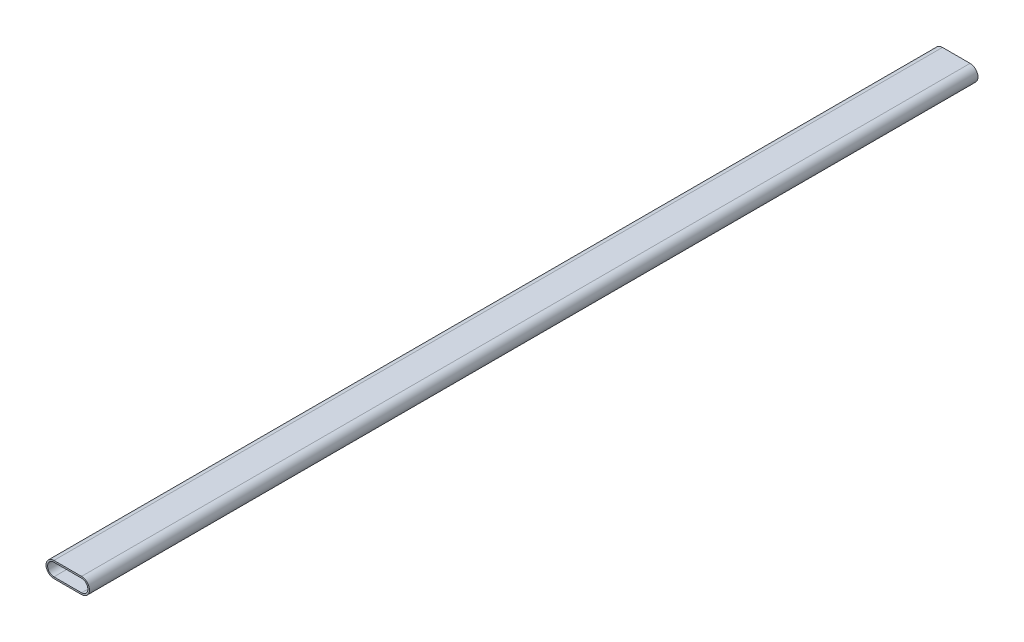
ISO-10303-21;
HEADER;
FILE_DESCRIPTION(('STEP AP214'),'2;1');
FILE_NAME('part.step','',(''),(''),'','','');
FILE_SCHEMA(('AUTOMOTIVE_DESIGN { 1 0 10303 214 1 1 1 1 }'));
ENDSEC;
DATA;
#1=APPLICATION_CONTEXT('core data for automotive mechanical design processes');
#2=APPLICATION_PROTOCOL_DEFINITION('international standard','automotive_design',2000,#1);
#3=PRODUCT_CONTEXT('',#1,'mechanical');
#4=PRODUCT('Part','Part','',(#3));
#5=PRODUCT_RELATED_PRODUCT_CATEGORY('part','',(#4));
#6=PRODUCT_DEFINITION_FORMATION('','',#4);
#7=PRODUCT_DEFINITION_CONTEXT('part definition',#1,'design');
#8=PRODUCT_DEFINITION('design','',#6,#7);
#9=PRODUCT_DEFINITION_SHAPE('','',#8);
#10=(LENGTH_UNIT() NAMED_UNIT(*) SI_UNIT(.MILLI.,.METRE.));
#11=(NAMED_UNIT(*) PLANE_ANGLE_UNIT() SI_UNIT($,.RADIAN.));
#12=(NAMED_UNIT(*) SI_UNIT($,.STERADIAN.) SOLID_ANGLE_UNIT());
#13=UNCERTAINTY_MEASURE_WITH_UNIT(LENGTH_MEASURE(1.E-05),#10,'distance_accuracy_value','');
#14=(GEOMETRIC_REPRESENTATION_CONTEXT(3) GLOBAL_UNCERTAINTY_ASSIGNED_CONTEXT((#13)) GLOBAL_UNIT_ASSIGNED_CONTEXT((#10,
#11,#12)) REPRESENTATION_CONTEXT('',''));
#15=CARTESIAN_POINT('',(0.,0.,0.));
#16=DIRECTION('',(0.,0.,1.));
#17=DIRECTION('',(1.,0.,0.));
#18=AXIS2_PLACEMENT_3D('',#15,#16,#17);
#19=CARTESIAN_POINT('',(0.,0.,675.));
#20=DIRECTION('',(0.,0.,1.));
#21=DIRECTION('',(1.,0.,0.));
#22=AXIS2_PLACEMENT_3D('',#19,#20,#21);
#23=PLANE('',#22);
#24=CARTESIAN_POINT('',(0.,0.,675.));
#25=DIRECTION('',(0.,0.,1.));
#26=DIRECTION('',(1.,0.,0.));
#27=AXIS2_PLACEMENT_3D('',#24,#25,#26);
#28=CIRCLE('',#27,6.);
#29=CARTESIAN_POINT('',(0.,6.,675.));
#30=VERTEX_POINT('',#29);
#31=CARTESIAN_POINT('',(0.,-6.,675.));
#32=VERTEX_POINT('',#31);
#33=EDGE_CURVE('E134',#30,#32,#28,.T.);
#34=ORIENTED_EDGE('',*,*,#33,.T.);
#35=DIRECTION('',(1.,0.,0.));
#36=VECTOR('',#35,1.);
#37=CARTESIAN_POINT('',(0.,-6.,675.));
#38=LINE('',#37,#36);
#39=CARTESIAN_POINT('',(21.,-6.,675.));
#40=VERTEX_POINT('',#39);
#41=EDGE_CURVE('E137',#32,#40,#38,.T.);
#42=ORIENTED_EDGE('',*,*,#41,.T.);
#43=CARTESIAN_POINT('',(21.,0.,675.));
#44=DIRECTION('',(0.,0.,1.));
#45=DIRECTION('',(1.,0.,0.));
#46=AXIS2_PLACEMENT_3D('',#43,#44,#45);
#47=CIRCLE('',#46,6.);
#48=CARTESIAN_POINT('',(21.,6.,675.));
#49=VERTEX_POINT('',#48);
#50=EDGE_CURVE('E140',#40,#49,#47,.T.);
#51=ORIENTED_EDGE('',*,*,#50,.T.);
#52=DIRECTION('',(-1.,0.,0.));
#53=VECTOR('',#52,1.);
#54=CARTESIAN_POINT('',(0.,6.,675.));
#55=LINE('',#54,#53);
#56=EDGE_CURVE('E142',#49,#30,#55,.T.);
#57=ORIENTED_EDGE('',*,*,#56,.T.);
#58=EDGE_LOOP('',(#34,#42,#51,#57));
#59=FACE_BOUND('',#58,.T.);
#60=DIRECTION('',(1.,0.,0.));
#61=VECTOR('',#60,1.);
#62=CARTESIAN_POINT('',(0.,-4.8,675.));
#63=LINE('',#62,#61);
#64=CARTESIAN_POINT('',(0.,-4.8,675.));
#65=VERTEX_POINT('',#64);
#66=CARTESIAN_POINT('',(21.,-4.8,675.));
#67=VERTEX_POINT('',#66);
#68=EDGE_CURVE('E106',#65,#67,#63,.T.);
#69=ORIENTED_EDGE('',*,*,#68,.F.);
#70=CARTESIAN_POINT('',(0.,0.,675.));
#71=DIRECTION('',(0.,0.,1.));
#72=DIRECTION('',(1.,0.,0.));
#73=AXIS2_PLACEMENT_3D('',#70,#71,#72);
#74=CIRCLE('',#73,4.8);
#75=CARTESIAN_POINT('',(0.,4.8,675.));
#76=VERTEX_POINT('',#75);
#77=EDGE_CURVE('E98',#76,#65,#74,.T.);
#78=ORIENTED_EDGE('',*,*,#77,.F.);
#79=DIRECTION('',(-1.,0.,0.));
#80=VECTOR('',#79,1.);
#81=CARTESIAN_POINT('',(0.,4.8,675.));
#82=LINE('',#81,#80);
#83=CARTESIAN_POINT('',(21.,4.8,675.));
#84=VERTEX_POINT('',#83);
#85=EDGE_CURVE('E120',#84,#76,#82,.T.);
#86=ORIENTED_EDGE('',*,*,#85,.F.);
#87=CARTESIAN_POINT('',(21.,0.,675.));
#88=DIRECTION('',(0.,0.,1.));
#89=DIRECTION('',(1.,0.,0.));
#90=AXIS2_PLACEMENT_3D('',#87,#88,#89);
#91=CIRCLE('',#90,4.8);
#92=EDGE_CURVE('E118',#67,#84,#91,.T.);
#93=ORIENTED_EDGE('',*,*,#92,.F.);
#94=EDGE_LOOP('',(#69,#78,#86,#93));
#95=FACE_BOUND('',#94,.T.);
#96=ADVANCED_FACE('F33',(#59,#95),#23,.T.);
#97=CARTESIAN_POINT('',(0.,0.,0.));
#98=DIRECTION('',(0.,0.,1.));
#99=DIRECTION('',(1.,0.,0.));
#100=AXIS2_PLACEMENT_3D('',#97,#98,#99);
#101=PLANE('',#100);
#102=CARTESIAN_POINT('',(0.,0.,0.));
#103=DIRECTION('',(0.,0.,1.));
#104=DIRECTION('',(1.,0.,0.));
#105=AXIS2_PLACEMENT_3D('',#102,#103,#104);
#106=CIRCLE('',#105,6.);
#107=CARTESIAN_POINT('',(0.,6.,0.));
#108=VERTEX_POINT('',#107);
#109=CARTESIAN_POINT('',(0.,-6.,0.));
#110=VERTEX_POINT('',#109);
#111=EDGE_CURVE('E114',#108,#110,#106,.T.);
#112=ORIENTED_EDGE('',*,*,#111,.F.);
#113=DIRECTION('',(-1.,0.,0.));
#114=VECTOR('',#113,1.);
#115=CARTESIAN_POINT('',(0.,6.,0.));
#116=LINE('',#115,#114);
#117=CARTESIAN_POINT('',(21.,6.,0.));
#118=VERTEX_POINT('',#117);
#119=EDGE_CURVE('E138',#118,#108,#116,.T.);
#120=ORIENTED_EDGE('',*,*,#119,.F.);
#121=CARTESIAN_POINT('',(21.,0.,0.));
#122=DIRECTION('',(0.,0.,1.));
#123=DIRECTION('',(1.,0.,0.));
#124=AXIS2_PLACEMENT_3D('',#121,#122,#123);
#125=CIRCLE('',#124,6.);
#126=CARTESIAN_POINT('',(21.,-6.,0.));
#127=VERTEX_POINT('',#126);
#128=EDGE_CURVE('E149',#127,#118,#125,.T.);
#129=ORIENTED_EDGE('',*,*,#128,.F.);
#130=DIRECTION('',(1.,0.,0.));
#131=VECTOR('',#130,1.);
#132=CARTESIAN_POINT('',(0.,-6.,0.));
#133=LINE('',#132,#131);
#134=EDGE_CURVE('E147',#110,#127,#133,.T.);
#135=ORIENTED_EDGE('',*,*,#134,.F.);
#136=EDGE_LOOP('',(#112,#120,#129,#135));
#137=FACE_BOUND('',#136,.T.);
#138=CARTESIAN_POINT('',(0.,0.,0.));
#139=DIRECTION('',(0.,0.,1.));
#140=DIRECTION('',(1.,0.,0.));
#141=AXIS2_PLACEMENT_3D('',#138,#139,#140);
#142=CIRCLE('',#141,4.8);
#143=CARTESIAN_POINT('',(0.,4.8,0.));
#144=VERTEX_POINT('',#143);
#145=CARTESIAN_POINT('',(0.,-4.8,0.));
#146=VERTEX_POINT('',#145);
#147=EDGE_CURVE('E56',#144,#146,#142,.T.);
#148=ORIENTED_EDGE('',*,*,#147,.T.);
#149=DIRECTION('',(1.,0.,0.));
#150=VECTOR('',#149,1.);
#151=CARTESIAN_POINT('',(0.,-4.8,0.));
#152=LINE('',#151,#150);
#153=CARTESIAN_POINT('',(21.,-4.8,0.));
#154=VERTEX_POINT('',#153);
#155=EDGE_CURVE('E113',#146,#154,#152,.T.);
#156=ORIENTED_EDGE('',*,*,#155,.T.);
#157=CARTESIAN_POINT('',(21.,0.,0.));
#158=DIRECTION('',(0.,0.,1.));
#159=DIRECTION('',(1.,0.,0.));
#160=AXIS2_PLACEMENT_3D('',#157,#158,#159);
#161=CIRCLE('',#160,4.8);
#162=CARTESIAN_POINT('',(21.,4.8,0.));
#163=VERTEX_POINT('',#162);
#164=EDGE_CURVE('E126',#154,#163,#161,.T.);
#165=ORIENTED_EDGE('',*,*,#164,.T.);
#166=DIRECTION('',(-1.,0.,0.));
#167=VECTOR('',#166,1.);
#168=CARTESIAN_POINT('',(0.,4.8,0.));
#169=LINE('',#168,#167);
#170=EDGE_CURVE('E107',#163,#144,#169,.T.);
#171=ORIENTED_EDGE('',*,*,#170,.T.);
#172=EDGE_LOOP('',(#148,#156,#165,#171));
#173=FACE_BOUND('',#172,.T.);
#174=ADVANCED_FACE('F167',(#137,#173),#101,.F.);
#175=CARTESIAN_POINT('',(0.,0.,675.));
#176=DIRECTION('',(0.,0.,-1.));
#177=DIRECTION('',(-1.,0.,0.));
#178=AXIS2_PLACEMENT_3D('',#175,#176,#177);
#179=CYLINDRICAL_SURFACE('',#178,6.);
#180=ORIENTED_EDGE('',*,*,#111,.T.);
#181=DIRECTION('',(0.,0.,-1.));
#182=VECTOR('',#181,1.);
#183=CARTESIAN_POINT('',(0.,-6.,675.));
#184=LINE('',#183,#182);
#185=EDGE_CURVE('E11',#32,#110,#184,.T.);
#186=ORIENTED_EDGE('',*,*,#185,.F.);
#187=ORIENTED_EDGE('',*,*,#33,.F.);
#188=DIRECTION('',(0.,0.,-1.));
#189=VECTOR('',#188,1.);
#190=CARTESIAN_POINT('',(0.,6.,675.));
#191=LINE('',#190,#189);
#192=EDGE_CURVE('E144',#30,#108,#191,.T.);
#193=ORIENTED_EDGE('',*,*,#192,.T.);
#194=EDGE_LOOP('',(#180,#186,#187,#193));
#195=FACE_BOUND('',#194,.T.);
#196=ADVANCED_FACE('F35',(#195),#179,.T.);
#197=CARTESIAN_POINT('',(0.,-6.,675.));
#198=DIRECTION('',(0.,1.,0.));
#199=DIRECTION('',(0.,0.,1.));
#200=AXIS2_PLACEMENT_3D('',#197,#198,#199);
#201=PLANE('',#200);
#202=ORIENTED_EDGE('',*,*,#134,.T.);
#203=DIRECTION('',(0.,0.,-1.));
#204=VECTOR('',#203,1.);
#205=CARTESIAN_POINT('',(21.,-6.,675.));
#206=LINE('',#205,#204);
#207=EDGE_CURVE('E41',#40,#127,#206,.T.);
#208=ORIENTED_EDGE('',*,*,#207,.F.);
#209=ORIENTED_EDGE('',*,*,#41,.F.);
#210=ORIENTED_EDGE('',*,*,#185,.T.);
#211=EDGE_LOOP('',(#202,#208,#209,#210));
#212=FACE_BOUND('',#211,.T.);
#213=ADVANCED_FACE('F177',(#212),#201,.F.);
#214=CARTESIAN_POINT('',(21.,0.,675.));
#215=DIRECTION('',(0.,0.,-1.));
#216=DIRECTION('',(-1.,0.,0.));
#217=AXIS2_PLACEMENT_3D('',#214,#215,#216);
#218=CYLINDRICAL_SURFACE('',#217,6.);
#219=ORIENTED_EDGE('',*,*,#128,.T.);
#220=DIRECTION('',(0.,0.,-1.));
#221=VECTOR('',#220,1.);
#222=CARTESIAN_POINT('',(21.,6.,675.));
#223=LINE('',#222,#221);
#224=EDGE_CURVE('E154',#49,#118,#223,.T.);
#225=ORIENTED_EDGE('',*,*,#224,.F.);
#226=ORIENTED_EDGE('',*,*,#50,.F.);
#227=ORIENTED_EDGE('',*,*,#207,.T.);
#228=EDGE_LOOP('',(#219,#225,#226,#227));
#229=FACE_BOUND('',#228,.T.);
#230=ADVANCED_FACE('F161',(#229),#218,.T.);
#231=CARTESIAN_POINT('',(0.,6.,675.));
#232=DIRECTION('',(0.,-1.,0.));
#233=DIRECTION('',(0.,0.,-1.));
#234=AXIS2_PLACEMENT_3D('',#231,#232,#233);
#235=PLANE('',#234);
#236=ORIENTED_EDGE('',*,*,#119,.T.);
#237=ORIENTED_EDGE('',*,*,#192,.F.);
#238=ORIENTED_EDGE('',*,*,#56,.F.);
#239=ORIENTED_EDGE('',*,*,#224,.T.);
#240=EDGE_LOOP('',(#236,#237,#238,#239));
#241=FACE_BOUND('',#240,.T.);
#242=ADVANCED_FACE('F171',(#241),#235,.F.);
#243=CARTESIAN_POINT('',(0.,0.,675.));
#244=DIRECTION('',(0.,0.,-1.));
#245=DIRECTION('',(-1.,0.,0.));
#246=AXIS2_PLACEMENT_3D('',#243,#244,#245);
#247=CYLINDRICAL_SURFACE('',#246,4.8);
#248=ORIENTED_EDGE('',*,*,#147,.F.);
#249=DIRECTION('',(0.,0.,-1.));
#250=VECTOR('',#249,1.);
#251=CARTESIAN_POINT('',(0.,4.8,675.));
#252=LINE('',#251,#250);
#253=EDGE_CURVE('E102',#76,#144,#252,.T.);
#254=ORIENTED_EDGE('',*,*,#253,.F.);
#255=ORIENTED_EDGE('',*,*,#77,.T.);
#256=DIRECTION('',(0.,0.,-1.));
#257=VECTOR('',#256,1.);
#258=CARTESIAN_POINT('',(0.,-4.8,675.));
#259=LINE('',#258,#257);
#260=EDGE_CURVE('E101',#65,#146,#259,.T.);
#261=ORIENTED_EDGE('',*,*,#260,.T.);
#262=EDGE_LOOP('',(#248,#254,#255,#261));
#263=FACE_BOUND('',#262,.T.);
#264=ADVANCED_FACE('F100',(#263),#247,.F.);
#265=CARTESIAN_POINT('',(0.,-4.8,675.));
#266=DIRECTION('',(0.,1.,0.));
#267=DIRECTION('',(0.,0.,1.));
#268=AXIS2_PLACEMENT_3D('',#265,#266,#267);
#269=PLANE('',#268);
#270=ORIENTED_EDGE('',*,*,#155,.F.);
#271=ORIENTED_EDGE('',*,*,#260,.F.);
#272=ORIENTED_EDGE('',*,*,#68,.T.);
#273=DIRECTION('',(0.,0.,-1.));
#274=VECTOR('',#273,1.);
#275=CARTESIAN_POINT('',(21.,-4.8,675.));
#276=LINE('',#275,#274);
#277=EDGE_CURVE('E115',#67,#154,#276,.T.);
#278=ORIENTED_EDGE('',*,*,#277,.T.);
#279=EDGE_LOOP('',(#270,#271,#272,#278));
#280=FACE_BOUND('',#279,.T.);
#281=ADVANCED_FACE('F110',(#280),#269,.T.);
#282=CARTESIAN_POINT('',(21.,0.,675.));
#283=DIRECTION('',(0.,0.,-1.));
#284=DIRECTION('',(-1.,0.,0.));
#285=AXIS2_PLACEMENT_3D('',#282,#283,#284);
#286=CYLINDRICAL_SURFACE('',#285,4.8);
#287=ORIENTED_EDGE('',*,*,#164,.F.);
#288=ORIENTED_EDGE('',*,*,#277,.F.);
#289=ORIENTED_EDGE('',*,*,#92,.T.);
#290=DIRECTION('',(0.,0.,-1.));
#291=VECTOR('',#290,1.);
#292=CARTESIAN_POINT('',(21.,4.8,675.));
#293=LINE('',#292,#291);
#294=EDGE_CURVE('E48',#84,#163,#293,.T.);
#295=ORIENTED_EDGE('',*,*,#294,.T.);
#296=EDGE_LOOP('',(#287,#288,#289,#295));
#297=FACE_BOUND('',#296,.T.);
#298=ADVANCED_FACE('F200',(#297),#286,.F.);
#299=CARTESIAN_POINT('',(0.,4.8,675.));
#300=DIRECTION('',(0.,-1.,0.));
#301=DIRECTION('',(0.,0.,-1.));
#302=AXIS2_PLACEMENT_3D('',#299,#300,#301);
#303=PLANE('',#302);
#304=ORIENTED_EDGE('',*,*,#170,.F.);
#305=ORIENTED_EDGE('',*,*,#294,.F.);
#306=ORIENTED_EDGE('',*,*,#85,.T.);
#307=ORIENTED_EDGE('',*,*,#253,.T.);
#308=EDGE_LOOP('',(#304,#305,#306,#307));
#309=FACE_BOUND('',#308,.T.);
#310=ADVANCED_FACE('F204',(#309),#303,.T.);
#311=CLOSED_SHELL('',(#96,#174,#196,#213,#230,#242,#264,#281,#298,#310));
#312=MANIFOLD_SOLID_BREP('B2',#311);
#313=ADVANCED_BREP_SHAPE_REPRESENTATION('',(#18,#312),#14);
#314=SHAPE_DEFINITION_REPRESENTATION(#9,#313);
ENDSEC;
END-ISO-10303-21;
